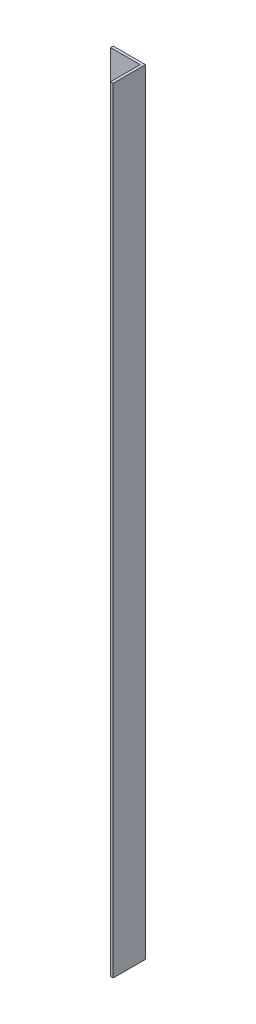
ISO-10303-21;
HEADER;
FILE_DESCRIPTION(('STEP AP214'),'2;1');
FILE_NAME('part.step','',(''),(''),'','','');
FILE_SCHEMA(('AUTOMOTIVE_DESIGN { 1 0 10303 214 1 1 1 1 }'));
ENDSEC;
DATA;
#1=APPLICATION_CONTEXT('core data for automotive mechanical design processes');
#2=APPLICATION_PROTOCOL_DEFINITION('international standard','automotive_design',2000,#1);
#3=PRODUCT_CONTEXT('',#1,'mechanical');
#4=PRODUCT('Part','Part','',(#3));
#5=PRODUCT_RELATED_PRODUCT_CATEGORY('part','',(#4));
#6=PRODUCT_DEFINITION_FORMATION('','',#4);
#7=PRODUCT_DEFINITION_CONTEXT('part definition',#1,'design');
#8=PRODUCT_DEFINITION('design','',#6,#7);
#9=PRODUCT_DEFINITION_SHAPE('','',#8);
#10=(LENGTH_UNIT() NAMED_UNIT(*) SI_UNIT(.MILLI.,.METRE.));
#11=(NAMED_UNIT(*) PLANE_ANGLE_UNIT() SI_UNIT($,.RADIAN.));
#12=(NAMED_UNIT(*) SI_UNIT($,.STERADIAN.) SOLID_ANGLE_UNIT());
#13=UNCERTAINTY_MEASURE_WITH_UNIT(LENGTH_MEASURE(1.E-05),#10,'distance_accuracy_value','');
#14=(GEOMETRIC_REPRESENTATION_CONTEXT(3) GLOBAL_UNCERTAINTY_ASSIGNED_CONTEXT((#13)) GLOBAL_UNIT_ASSIGNED_CONTEXT((#10,
#11,#12)) REPRESENTATION_CONTEXT('',''));
#15=CARTESIAN_POINT('',(0.,0.,0.));
#16=DIRECTION('',(0.,0.,1.));
#17=DIRECTION('',(1.,0.,0.));
#18=AXIS2_PLACEMENT_3D('',#15,#16,#17);
#19=CARTESIAN_POINT('',(0.,457.2,-19.05));
#20=DIRECTION('',(0.,0.,1.));
#21=DIRECTION('',(1.,0.,0.));
#22=AXIS2_PLACEMENT_3D('',#19,#20,#21);
#23=PLANE('',#22);
#24=DIRECTION('',(-1.,0.,0.));
#25=VECTOR('',#24,1.);
#26=CARTESIAN_POINT('',(0.,0.,-19.05));
#27=LINE('',#26,#25);
#28=CARTESIAN_POINT('',(0.,0.,-19.05));
#29=VERTEX_POINT('',#28);
#30=CARTESIAN_POINT('',(-19.05,0.,-19.05));
#31=VERTEX_POINT('',#30);
#32=EDGE_CURVE('E114',#29,#31,#27,.T.);
#33=ORIENTED_EDGE('',*,*,#32,.T.);
#34=DIRECTION('',(0.,-1.,0.));
#35=VECTOR('',#34,1.);
#36=CARTESIAN_POINT('',(-19.05,457.2,-19.05));
#37=LINE('',#36,#35);
#38=CARTESIAN_POINT('',(-19.05,457.2,-19.05));
#39=VERTEX_POINT('',#38);
#40=EDGE_CURVE('E11',#39,#31,#37,.T.);
#41=ORIENTED_EDGE('',*,*,#40,.F.);
#42=DIRECTION('',(-1.,0.,0.));
#43=VECTOR('',#42,1.);
#44=CARTESIAN_POINT('',(0.,457.2,-19.05));
#45=LINE('',#44,#43);
#46=CARTESIAN_POINT('',(0.,457.2,-19.05));
#47=VERTEX_POINT('',#46);
#48=EDGE_CURVE('E79',#47,#39,#45,.T.);
#49=ORIENTED_EDGE('',*,*,#48,.F.);
#50=DIRECTION('',(0.,-1.,0.));
#51=VECTOR('',#50,1.);
#52=CARTESIAN_POINT('',(0.,457.2,-19.05));
#53=LINE('',#52,#51);
#54=EDGE_CURVE('E110',#47,#29,#53,.T.);
#55=ORIENTED_EDGE('',*,*,#54,.T.);
#56=EDGE_LOOP('',(#33,#41,#49,#55));
#57=FACE_BOUND('',#56,.T.);
#58=ADVANCED_FACE('F33',(#57),#23,.F.);
#59=CARTESIAN_POINT('',(-19.05,457.2,-17.4625));
#60=DIRECTION('',(-1.,0.,0.));
#61=DIRECTION('',(0.,0.,1.));
#62=AXIS2_PLACEMENT_3D('',#59,#60,#61);
#63=PLANE('',#62);
#64=DIRECTION('',(0.,0.,-1.));
#65=VECTOR('',#64,1.);
#66=CARTESIAN_POINT('',(-19.05,0.,-17.4625));
#67=LINE('',#66,#65);
#68=CARTESIAN_POINT('',(-19.05,0.,-17.4625));
#69=VERTEX_POINT('',#68);
#70=EDGE_CURVE('E117',#69,#31,#67,.T.);
#71=ORIENTED_EDGE('',*,*,#70,.F.);
#72=DIRECTION('',(0.,-1.,0.));
#73=VECTOR('',#72,1.);
#74=CARTESIAN_POINT('',(-19.05,457.2,-17.4625));
#75=LINE('',#74,#73);
#76=CARTESIAN_POINT('',(-19.05,457.2,-17.4625));
#77=VERTEX_POINT('',#76);
#78=EDGE_CURVE('E41',#77,#69,#75,.T.);
#79=ORIENTED_EDGE('',*,*,#78,.F.);
#80=DIRECTION('',(0.,0.,-1.));
#81=VECTOR('',#80,1.);
#82=CARTESIAN_POINT('',(-19.05,457.2,-17.4625));
#83=LINE('',#82,#81);
#84=EDGE_CURVE('E203',#77,#39,#83,.T.);
#85=ORIENTED_EDGE('',*,*,#84,.T.);
#86=ORIENTED_EDGE('',*,*,#40,.T.);
#87=EDGE_LOOP('',(#71,#79,#85,#86));
#88=FACE_BOUND('',#87,.T.);
#89=ADVANCED_FACE('F135',(#88),#63,.T.);
#90=CARTESIAN_POINT('',(0.,457.2,-17.4625));
#91=DIRECTION('',(0.,0.,1.));
#92=DIRECTION('',(1.,0.,0.));
#93=AXIS2_PLACEMENT_3D('',#90,#91,#92);
#94=PLANE('',#93);
#95=DIRECTION('',(-1.,0.,0.));
#96=VECTOR('',#95,1.);
#97=CARTESIAN_POINT('',(0.,0.,-17.4625));
#98=LINE('',#97,#96);
#99=CARTESIAN_POINT('',(-1.5875,0.,-17.4625));
#100=VERTEX_POINT('',#99);
#101=EDGE_CURVE('E120',#100,#69,#98,.T.);
#102=ORIENTED_EDGE('',*,*,#101,.F.);
#103=DIRECTION('',(0.,-1.,0.));
#104=VECTOR('',#103,1.);
#105=CARTESIAN_POINT('',(-1.5875,457.2,-17.4625));
#106=LINE('',#105,#104);
#107=CARTESIAN_POINT('',(-1.5875,457.2,-17.4625));
#108=VERTEX_POINT('',#107);
#109=EDGE_CURVE('E100',#108,#100,#106,.T.);
#110=ORIENTED_EDGE('',*,*,#109,.F.);
#111=DIRECTION('',(-1.,0.,0.));
#112=VECTOR('',#111,1.);
#113=CARTESIAN_POINT('',(0.,457.2,-17.4625));
#114=LINE('',#113,#112);
#115=EDGE_CURVE('E106',#108,#77,#114,.T.);
#116=ORIENTED_EDGE('',*,*,#115,.T.);
#117=ORIENTED_EDGE('',*,*,#78,.T.);
#118=EDGE_LOOP('',(#102,#110,#116,#117));
#119=FACE_BOUND('',#118,.T.);
#120=ADVANCED_FACE('F132',(#119),#94,.T.);
#121=CARTESIAN_POINT('',(-1.5875,457.2,0.));
#122=DIRECTION('',(-1.,0.,0.));
#123=DIRECTION('',(0.,0.,1.));
#124=AXIS2_PLACEMENT_3D('',#121,#122,#123);
#125=PLANE('',#124);
#126=DIRECTION('',(0.,0.,-1.));
#127=VECTOR('',#126,1.);
#128=CARTESIAN_POINT('',(-1.5875,0.,0.));
#129=LINE('',#128,#127);
#130=CARTESIAN_POINT('',(-1.5875,0.,0.));
#131=VERTEX_POINT('',#130);
#132=EDGE_CURVE('E95',#131,#100,#129,.T.);
#133=ORIENTED_EDGE('',*,*,#132,.F.);
#134=DIRECTION('',(0.,-1.,0.));
#135=VECTOR('',#134,1.);
#136=CARTESIAN_POINT('',(-1.5875,457.2,0.));
#137=LINE('',#136,#135);
#138=CARTESIAN_POINT('',(-1.5875,457.2,0.));
#139=VERTEX_POINT('',#138);
#140=EDGE_CURVE('E90',#139,#131,#137,.T.);
#141=ORIENTED_EDGE('',*,*,#140,.F.);
#142=DIRECTION('',(0.,0.,-1.));
#143=VECTOR('',#142,1.);
#144=CARTESIAN_POINT('',(-1.5875,457.2,0.));
#145=LINE('',#144,#143);
#146=EDGE_CURVE('E93',#139,#108,#145,.T.);
#147=ORIENTED_EDGE('',*,*,#146,.T.);
#148=ORIENTED_EDGE('',*,*,#109,.T.);
#149=EDGE_LOOP('',(#133,#141,#147,#148));
#150=FACE_BOUND('',#149,.T.);
#151=ADVANCED_FACE('F92',(#150),#125,.T.);
#152=CARTESIAN_POINT('',(0.,457.2,0.));
#153=DIRECTION('',(0.,0.,1.));
#154=DIRECTION('',(1.,0.,0.));
#155=AXIS2_PLACEMENT_3D('',#152,#153,#154);
#156=PLANE('',#155);
#157=DIRECTION('',(-1.,0.,0.));
#158=VECTOR('',#157,1.);
#159=CARTESIAN_POINT('',(0.,0.,0.));
#160=LINE('',#159,#158);
#161=CARTESIAN_POINT('',(0.,0.,0.));
#162=VERTEX_POINT('',#161);
#163=EDGE_CURVE('E124',#162,#131,#160,.T.);
#164=ORIENTED_EDGE('',*,*,#163,.F.);
#165=DIRECTION('',(0.,-1.,0.));
#166=VECTOR('',#165,1.);
#167=CARTESIAN_POINT('',(0.,457.2,0.));
#168=LINE('',#167,#166);
#169=CARTESIAN_POINT('',(0.,457.2,0.));
#170=VERTEX_POINT('',#169);
#171=EDGE_CURVE('E70',#170,#162,#168,.T.);
#172=ORIENTED_EDGE('',*,*,#171,.F.);
#173=DIRECTION('',(-1.,0.,0.));
#174=VECTOR('',#173,1.);
#175=CARTESIAN_POINT('',(0.,457.2,0.));
#176=LINE('',#175,#174);
#177=EDGE_CURVE('E104',#170,#139,#176,.T.);
#178=ORIENTED_EDGE('',*,*,#177,.T.);
#179=ORIENTED_EDGE('',*,*,#140,.T.);
#180=EDGE_LOOP('',(#164,#172,#178,#179));
#181=FACE_BOUND('',#180,.T.);
#182=ADVANCED_FACE('F108',(#181),#156,.T.);
#183=CARTESIAN_POINT('',(0.,457.2,0.));
#184=DIRECTION('',(-1.,0.,0.));
#185=DIRECTION('',(0.,0.,1.));
#186=AXIS2_PLACEMENT_3D('',#183,#184,#185);
#187=PLANE('',#186);
#188=DIRECTION('',(0.,0.,-1.));
#189=VECTOR('',#188,1.);
#190=CARTESIAN_POINT('',(0.,0.,0.));
#191=LINE('',#190,#189);
#192=EDGE_CURVE('E73',#162,#29,#191,.T.);
#193=ORIENTED_EDGE('',*,*,#192,.T.);
#194=ORIENTED_EDGE('',*,*,#54,.F.);
#195=DIRECTION('',(0.,0.,-1.));
#196=VECTOR('',#195,1.);
#197=CARTESIAN_POINT('',(0.,457.2,0.));
#198=LINE('',#197,#196);
#199=EDGE_CURVE('E49',#170,#47,#198,.T.);
#200=ORIENTED_EDGE('',*,*,#199,.F.);
#201=ORIENTED_EDGE('',*,*,#171,.T.);
#202=EDGE_LOOP('',(#193,#194,#200,#201));
#203=FACE_BOUND('',#202,.T.);
#204=ADVANCED_FACE('F140',(#203),#187,.F.);
#205=CARTESIAN_POINT('',(0.,457.2,0.));
#206=DIRECTION('',(0.,-1.,0.));
#207=DIRECTION('',(-1.,0.,0.));
#208=AXIS2_PLACEMENT_3D('',#205,#206,#207);
#209=PLANE('',#208);
#210=ORIENTED_EDGE('',*,*,#48,.T.);
#211=ORIENTED_EDGE('',*,*,#84,.F.);
#212=ORIENTED_EDGE('',*,*,#115,.F.);
#213=ORIENTED_EDGE('',*,*,#146,.F.);
#214=ORIENTED_EDGE('',*,*,#177,.F.);
#215=ORIENTED_EDGE('',*,*,#199,.T.);
#216=EDGE_LOOP('',(#210,#211,#212,#213,#214,#215));
#217=FACE_BOUND('',#216,.T.);
#218=ADVANCED_FACE('F103',(#217),#209,.F.);
#219=CARTESIAN_POINT('',(0.,0.,0.));
#220=DIRECTION('',(0.,-1.,0.));
#221=DIRECTION('',(-1.,0.,0.));
#222=AXIS2_PLACEMENT_3D('',#219,#220,#221);
#223=PLANE('',#222);
#224=ORIENTED_EDGE('',*,*,#32,.F.);
#225=ORIENTED_EDGE('',*,*,#192,.F.);
#226=ORIENTED_EDGE('',*,*,#163,.T.);
#227=ORIENTED_EDGE('',*,*,#132,.T.);
#228=ORIENTED_EDGE('',*,*,#101,.T.);
#229=ORIENTED_EDGE('',*,*,#70,.T.);
#230=EDGE_LOOP('',(#224,#225,#226,#227,#228,#229));
#231=FACE_BOUND('',#230,.T.);
#232=ADVANCED_FACE('F138',(#231),#223,.T.);
#233=CLOSED_SHELL('',(#58,#89,#120,#151,#182,#204,#218,#232));
#234=MANIFOLD_SOLID_BREP('B2',#233);
#235=ADVANCED_BREP_SHAPE_REPRESENTATION('',(#18,#234),#14);
#236=SHAPE_DEFINITION_REPRESENTATION(#9,#235);
ENDSEC;
END-ISO-10303-21;
